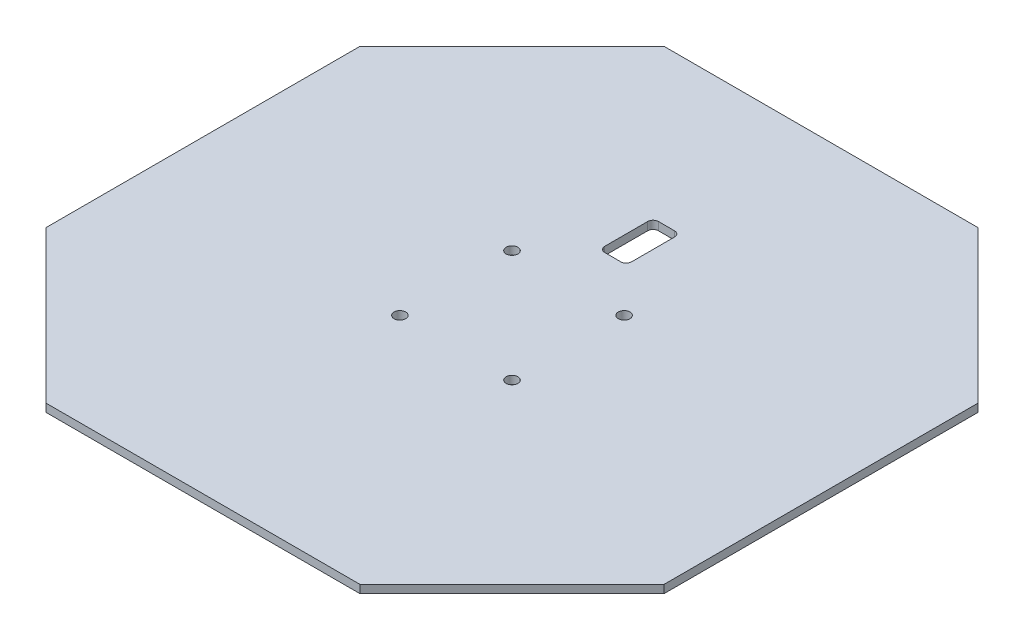
ISO-10303-21;
HEADER;
FILE_DESCRIPTION(('STEP AP214'),'2;1');
FILE_NAME('part.step','',(''),(''),'','','');
FILE_SCHEMA(('AUTOMOTIVE_DESIGN { 1 0 10303 214 1 1 1 1 }'));
ENDSEC;
DATA;
#1=APPLICATION_CONTEXT('core data for automotive mechanical design processes');
#2=APPLICATION_PROTOCOL_DEFINITION('international standard','automotive_design',2000,#1);
#3=PRODUCT_CONTEXT('',#1,'mechanical');
#4=PRODUCT('Part','Part','',(#3));
#5=PRODUCT_RELATED_PRODUCT_CATEGORY('part','',(#4));
#6=PRODUCT_DEFINITION_FORMATION('','',#4);
#7=PRODUCT_DEFINITION_CONTEXT('part definition',#1,'design');
#8=PRODUCT_DEFINITION('design','',#6,#7);
#9=PRODUCT_DEFINITION_SHAPE('','',#8);
#10=(LENGTH_UNIT() NAMED_UNIT(*) SI_UNIT(.MILLI.,.METRE.));
#11=(NAMED_UNIT(*) PLANE_ANGLE_UNIT() SI_UNIT($,.RADIAN.));
#12=(NAMED_UNIT(*) SI_UNIT($,.STERADIAN.) SOLID_ANGLE_UNIT());
#13=UNCERTAINTY_MEASURE_WITH_UNIT(LENGTH_MEASURE(1.E-05),#10,'distance_accuracy_value','');
#14=(GEOMETRIC_REPRESENTATION_CONTEXT(3) GLOBAL_UNCERTAINTY_ASSIGNED_CONTEXT((#13)) GLOBAL_UNIT_ASSIGNED_CONTEXT((#10,
#11,#12)) REPRESENTATION_CONTEXT('',''));
#15=CARTESIAN_POINT('',(0.,0.,0.));
#16=DIRECTION('',(0.,0.,1.));
#17=DIRECTION('',(1.,0.,0.));
#18=AXIS2_PLACEMENT_3D('',#15,#16,#17);
#19=CARTESIAN_POINT('',(112.,0.,-154.5));
#20=DIRECTION('',(0.,-1.,0.));
#21=DIRECTION('',(0.,0.,-1.));
#22=AXIS2_PLACEMENT_3D('',#19,#20,#21);
#23=CYLINDRICAL_SURFACE('',#22,2.);
#24=DIRECTION('',(0.,1.,0.));
#25=VECTOR('',#24,1.);
#26=CARTESIAN_POINT('',(112.,0.,-152.5));
#27=LINE('',#26,#25);
#28=CARTESIAN_POINT('',(112.,0.,-152.5));
#29=VERTEX_POINT('',#28);
#30=CARTESIAN_POINT('',(112.,3.,-152.5));
#31=VERTEX_POINT('',#30);
#32=EDGE_CURVE('E297',#29,#31,#27,.T.);
#33=ORIENTED_EDGE('',*,*,#32,.F.);
#34=CARTESIAN_POINT('',(112.,0.,-154.5));
#35=DIRECTION('',(0.,-1.,0.));
#36=DIRECTION('',(0.,0.,-1.));
#37=AXIS2_PLACEMENT_3D('',#34,#35,#36);
#38=CIRCLE('',#37,2.);
#39=CARTESIAN_POINT('',(110.,0.,-154.5));
#40=VERTEX_POINT('',#39);
#41=EDGE_CURVE('E60',#29,#40,#38,.T.);
#42=ORIENTED_EDGE('',*,*,#41,.T.);
#43=DIRECTION('',(0.,1.,0.));
#44=VECTOR('',#43,1.);
#45=CARTESIAN_POINT('',(110.,0.,-154.5));
#46=LINE('',#45,#44);
#47=CARTESIAN_POINT('',(110.,3.,-154.5));
#48=VERTEX_POINT('',#47);
#49=EDGE_CURVE('E301',#48,#40,#46,.F.);
#50=ORIENTED_EDGE('',*,*,#49,.F.);
#51=CARTESIAN_POINT('',(112.,3.,-154.5));
#52=DIRECTION('',(0.,-1.,0.));
#53=DIRECTION('',(0.,0.,-1.));
#54=AXIS2_PLACEMENT_3D('',#51,#52,#53);
#55=CIRCLE('',#54,2.);
#56=EDGE_CURVE('E13',#48,#31,#55,.F.);
#57=ORIENTED_EDGE('',*,*,#56,.T.);
#58=EDGE_LOOP('',(#33,#42,#50,#57));
#59=FACE_BOUND('',#58,.T.);
#60=ADVANCED_FACE('F52',(#59),#23,.F.);
#61=CARTESIAN_POINT('',(118.,0.,-154.5));
#62=DIRECTION('',(0.,-1.,0.));
#63=DIRECTION('',(0.,0.,-1.));
#64=AXIS2_PLACEMENT_3D('',#61,#62,#63);
#65=CYLINDRICAL_SURFACE('',#64,2.);
#66=DIRECTION('',(0.,1.,0.));
#67=VECTOR('',#66,1.);
#68=CARTESIAN_POINT('',(120.,0.,-154.5));
#69=LINE('',#68,#67);
#70=CARTESIAN_POINT('',(120.,0.,-154.5));
#71=VERTEX_POINT('',#70);
#72=CARTESIAN_POINT('',(120.,3.,-154.5));
#73=VERTEX_POINT('',#72);
#74=EDGE_CURVE('E282',#71,#73,#69,.T.);
#75=ORIENTED_EDGE('',*,*,#74,.F.);
#76=CARTESIAN_POINT('',(118.,0.,-154.5));
#77=DIRECTION('',(0.,-1.,0.));
#78=DIRECTION('',(0.,0.,-1.));
#79=AXIS2_PLACEMENT_3D('',#76,#77,#78);
#80=CIRCLE('',#79,2.);
#81=CARTESIAN_POINT('',(118.,0.,-152.5));
#82=VERTEX_POINT('',#81);
#83=EDGE_CURVE('E290',#71,#82,#80,.T.);
#84=ORIENTED_EDGE('',*,*,#83,.T.);
#85=DIRECTION('',(0.,1.,0.));
#86=VECTOR('',#85,1.);
#87=CARTESIAN_POINT('',(118.,0.,-152.5));
#88=LINE('',#87,#86);
#89=CARTESIAN_POINT('',(118.,3.,-152.5));
#90=VERTEX_POINT('',#89);
#91=EDGE_CURVE('E286',#90,#82,#88,.F.);
#92=ORIENTED_EDGE('',*,*,#91,.F.);
#93=CARTESIAN_POINT('',(118.,3.,-154.5));
#94=DIRECTION('',(0.,-1.,0.));
#95=DIRECTION('',(0.,0.,-1.));
#96=AXIS2_PLACEMENT_3D('',#93,#94,#95);
#97=CIRCLE('',#96,2.);
#98=EDGE_CURVE('E294',#90,#73,#97,.F.);
#99=ORIENTED_EDGE('',*,*,#98,.T.);
#100=EDGE_LOOP('',(#75,#84,#92,#99));
#101=FACE_BOUND('',#100,.T.);
#102=ADVANCED_FACE('F380',(#101),#65,.F.);
#103=CARTESIAN_POINT('',(112.,0.,-170.5));
#104=DIRECTION('',(0.,1.,0.));
#105=DIRECTION('',(0.,0.,1.));
#106=AXIS2_PLACEMENT_3D('',#103,#104,#105);
#107=CYLINDRICAL_SURFACE('',#106,2.);
#108=DIRECTION('',(0.,-1.,0.));
#109=VECTOR('',#108,1.);
#110=CARTESIAN_POINT('',(112.,0.,-172.5));
#111=LINE('',#110,#109);
#112=CARTESIAN_POINT('',(112.,3.,-172.5));
#113=VERTEX_POINT('',#112);
#114=CARTESIAN_POINT('',(112.,0.,-172.5));
#115=VERTEX_POINT('',#114);
#116=EDGE_CURVE('E268',#113,#115,#111,.T.);
#117=ORIENTED_EDGE('',*,*,#116,.F.);
#118=CARTESIAN_POINT('',(112.,3.,-170.5));
#119=DIRECTION('',(0.,-1.,0.));
#120=DIRECTION('',(0.,0.,-1.));
#121=AXIS2_PLACEMENT_3D('',#118,#119,#120);
#122=CIRCLE('',#121,2.);
#123=CARTESIAN_POINT('',(110.,3.,-170.5));
#124=VERTEX_POINT('',#123);
#125=EDGE_CURVE('E276',#113,#124,#122,.F.);
#126=ORIENTED_EDGE('',*,*,#125,.T.);
#127=DIRECTION('',(0.,-1.,0.));
#128=VECTOR('',#127,1.);
#129=CARTESIAN_POINT('',(110.,0.,-170.5));
#130=LINE('',#129,#128);
#131=CARTESIAN_POINT('',(110.,0.,-170.5));
#132=VERTEX_POINT('',#131);
#133=EDGE_CURVE('E272',#132,#124,#130,.F.);
#134=ORIENTED_EDGE('',*,*,#133,.F.);
#135=CARTESIAN_POINT('',(112.,0.,-170.5));
#136=DIRECTION('',(0.,-1.,0.));
#137=DIRECTION('',(0.,0.,-1.));
#138=AXIS2_PLACEMENT_3D('',#135,#136,#137);
#139=CIRCLE('',#138,2.);
#140=EDGE_CURVE('E279',#132,#115,#139,.T.);
#141=ORIENTED_EDGE('',*,*,#140,.T.);
#142=EDGE_LOOP('',(#117,#126,#134,#141));
#143=FACE_BOUND('',#142,.T.);
#144=ADVANCED_FACE('F402',(#143),#107,.F.);
#145=CARTESIAN_POINT('',(118.,0.,-170.5));
#146=DIRECTION('',(0.,1.,0.));
#147=DIRECTION('',(0.,0.,1.));
#148=AXIS2_PLACEMENT_3D('',#145,#146,#147);
#149=CYLINDRICAL_SURFACE('',#148,2.);
#150=DIRECTION('',(0.,-1.,0.));
#151=VECTOR('',#150,1.);
#152=CARTESIAN_POINT('',(120.,0.,-170.5));
#153=LINE('',#152,#151);
#154=CARTESIAN_POINT('',(120.,3.,-170.5));
#155=VERTEX_POINT('',#154);
#156=CARTESIAN_POINT('',(120.,0.,-170.5));
#157=VERTEX_POINT('',#156);
#158=EDGE_CURVE('E253',#155,#157,#153,.T.);
#159=ORIENTED_EDGE('',*,*,#158,.F.);
#160=CARTESIAN_POINT('',(118.,3.,-170.5));
#161=DIRECTION('',(0.,-1.,0.));
#162=DIRECTION('',(0.,0.,-1.));
#163=AXIS2_PLACEMENT_3D('',#160,#161,#162);
#164=CIRCLE('',#163,2.);
#165=CARTESIAN_POINT('',(118.,3.,-172.5));
#166=VERTEX_POINT('',#165);
#167=EDGE_CURVE('E261',#155,#166,#164,.F.);
#168=ORIENTED_EDGE('',*,*,#167,.T.);
#169=DIRECTION('',(0.,-1.,0.));
#170=VECTOR('',#169,1.);
#171=CARTESIAN_POINT('',(118.,0.,-172.5));
#172=LINE('',#171,#170);
#173=CARTESIAN_POINT('',(118.,0.,-172.5));
#174=VERTEX_POINT('',#173);
#175=EDGE_CURVE('E257',#174,#166,#172,.F.);
#176=ORIENTED_EDGE('',*,*,#175,.F.);
#177=CARTESIAN_POINT('',(118.,0.,-170.5));
#178=DIRECTION('',(0.,-1.,0.));
#179=DIRECTION('',(0.,0.,-1.));
#180=AXIS2_PLACEMENT_3D('',#177,#178,#179);
#181=CIRCLE('',#180,2.);
#182=EDGE_CURVE('E264',#174,#157,#181,.T.);
#183=ORIENTED_EDGE('',*,*,#182,.T.);
#184=EDGE_LOOP('',(#159,#168,#176,#183));
#185=FACE_BOUND('',#184,.T.);
#186=ADVANCED_FACE('F393',(#185),#149,.F.);
#187=CARTESIAN_POINT('',(0.,3.,0.));
#188=DIRECTION('',(0.,-1.,0.));
#189=DIRECTION('',(0.,0.,-1.));
#190=AXIS2_PLACEMENT_3D('',#187,#188,#189);
#191=PLANE('',#190);
#192=DIRECTION('',(1.,0.,0.));
#193=VECTOR('',#192,1.);
#194=CARTESIAN_POINT('',(115.,3.,-152.5));
#195=LINE('',#194,#193);
#196=EDGE_CURVE('E359',#31,#90,#195,.T.);
#197=ORIENTED_EDGE('',*,*,#196,.F.);
#198=ORIENTED_EDGE('',*,*,#56,.F.);
#199=DIRECTION('',(0.,0.,1.));
#200=VECTOR('',#199,1.);
#201=CARTESIAN_POINT('',(110.,3.,-152.5));
#202=LINE('',#201,#200);
#203=EDGE_CURVE('E347',#124,#48,#202,.T.);
#204=ORIENTED_EDGE('',*,*,#203,.F.);
#205=ORIENTED_EDGE('',*,*,#125,.F.);
#206=DIRECTION('',(-1.,0.,0.));
#207=VECTOR('',#206,1.);
#208=CARTESIAN_POINT('',(120.,3.,-172.5));
#209=LINE('',#208,#207);
#210=EDGE_CURVE('E352',#166,#113,#209,.T.);
#211=ORIENTED_EDGE('',*,*,#210,.F.);
#212=ORIENTED_EDGE('',*,*,#167,.F.);
#213=DIRECTION('',(0.,0.,-1.));
#214=VECTOR('',#213,1.);
#215=CARTESIAN_POINT('',(120.,3.,-152.5));
#216=LINE('',#215,#214);
#217=EDGE_CURVE('E356',#73,#155,#216,.T.);
#218=ORIENTED_EDGE('',*,*,#217,.F.);
#219=ORIENTED_EDGE('',*,*,#98,.F.);
#220=EDGE_LOOP('',(#197,#198,#204,#205,#211,#212,#218,#219));
#221=FACE_BOUND('',#220,.T.);
#222=CARTESIAN_POINT('',(135.859650045008,3.,-135.859650045004));
#223=DIRECTION('',(0.,1.,0.));
#224=DIRECTION('',(0.,0.,1.));
#225=AXIS2_PLACEMENT_3D('',#222,#223,#224);
#226=CIRCLE('',#225,2.182876);
#227=CARTESIAN_POINT('',(135.859650045008,3.,-133.676774045004));
#228=VERTEX_POINT('',#227);
#229=EDGE_CURVE('E334',#228,#228,#226,.T.);
#230=ORIENTED_EDGE('',*,*,#229,.F.);
#231=EDGE_LOOP('',(#230));
#232=FACE_BOUND('',#231,.T.);
#233=CARTESIAN_POINT('',(94.1403499550013,3.,-94.1403499549967));
#234=DIRECTION('',(0.,1.,0.));
#235=DIRECTION('',(0.,0.,1.));
#236=AXIS2_PLACEMENT_3D('',#233,#234,#235);
#237=CIRCLE('',#236,2.182876);
#238=CARTESIAN_POINT('',(94.1403499550013,3.,-91.9574739549966));
#239=VERTEX_POINT('',#238);
#240=EDGE_CURVE('E318',#239,#239,#237,.T.);
#241=ORIENTED_EDGE('',*,*,#240,.F.);
#242=EDGE_LOOP('',(#241));
#243=FACE_BOUND('',#242,.T.);
#244=DIRECTION('',(1.,0.,0.));
#245=VECTOR('',#244,1.);
#246=CARTESIAN_POINT('',(0.,3.,0.));
#247=LINE('',#246,#245);
#248=CARTESIAN_POINT('',(56.5685,3.,0.));
#249=VERTEX_POINT('',#248);
#250=CARTESIAN_POINT('',(173.4315,3.,0.));
#251=VERTEX_POINT('',#250);
#252=EDGE_CURVE('E185',#249,#251,#247,.T.);
#253=ORIENTED_EDGE('',*,*,#252,.T.);
#254=DIRECTION('',(-0.707106781186547,0.,0.707106781186548));
#255=VECTOR('',#254,1.);
#256=CARTESIAN_POINT('',(230.,3.,-56.5685));
#257=LINE('',#256,#255);
#258=CARTESIAN_POINT('',(230.,3.,-56.5685));
#259=VERTEX_POINT('',#258);
#260=EDGE_CURVE('E248',#251,#259,#257,.F.);
#261=ORIENTED_EDGE('',*,*,#260,.T.);
#262=DIRECTION('',(0.,0.,-1.));
#263=VECTOR('',#262,1.);
#264=CARTESIAN_POINT('',(230.,3.,0.));
#265=LINE('',#264,#263);
#266=CARTESIAN_POINT('',(230.,3.,-173.4315));
#267=VERTEX_POINT('',#266);
#268=EDGE_CURVE('E306',#259,#267,#265,.T.);
#269=ORIENTED_EDGE('',*,*,#268,.T.);
#270=DIRECTION('',(0.707106781186548,0.,0.707106781186548));
#271=VECTOR('',#270,1.);
#272=CARTESIAN_POINT('',(173.4315,3.,-230.));
#273=LINE('',#272,#271);
#274=CARTESIAN_POINT('',(173.4315,3.,-230.));
#275=VERTEX_POINT('',#274);
#276=EDGE_CURVE('E234',#267,#275,#273,.F.);
#277=ORIENTED_EDGE('',*,*,#276,.T.);
#278=DIRECTION('',(-1.,0.,0.));
#279=VECTOR('',#278,1.);
#280=CARTESIAN_POINT('',(0.,3.,-230.));
#281=LINE('',#280,#279);
#282=CARTESIAN_POINT('',(56.5685,3.,-230.));
#283=VERTEX_POINT('',#282);
#284=EDGE_CURVE('E187',#275,#283,#281,.T.);
#285=ORIENTED_EDGE('',*,*,#284,.T.);
#286=DIRECTION('',(0.707106781186548,0.,-0.707106781186547));
#287=VECTOR('',#286,1.);
#288=CARTESIAN_POINT('',(0.,3.,-173.4315));
#289=LINE('',#288,#287);
#290=CARTESIAN_POINT('',(0.,3.,-173.4315));
#291=VERTEX_POINT('',#290);
#292=EDGE_CURVE('E219',#283,#291,#289,.F.);
#293=ORIENTED_EDGE('',*,*,#292,.T.);
#294=DIRECTION('',(0.,0.,1.));
#295=VECTOR('',#294,1.);
#296=CARTESIAN_POINT('',(0.,3.,0.));
#297=LINE('',#296,#295);
#298=CARTESIAN_POINT('',(0.,3.,-56.5685));
#299=VERTEX_POINT('',#298);
#300=EDGE_CURVE('E206',#291,#299,#297,.T.);
#301=ORIENTED_EDGE('',*,*,#300,.T.);
#302=DIRECTION('',(-0.707106781186548,0.,-0.707106781186547));
#303=VECTOR('',#302,1.);
#304=CARTESIAN_POINT('',(56.5685,3.,0.));
#305=LINE('',#304,#303);
#306=EDGE_CURVE('E177',#299,#249,#305,.F.);
#307=ORIENTED_EDGE('',*,*,#306,.T.);
#308=EDGE_LOOP('',(#253,#261,#269,#277,#285,#293,#301,#307));
#309=FACE_BOUND('',#308,.T.);
#310=CARTESIAN_POINT('',(135.859650045002,3.,-94.1403499549978));
#311=DIRECTION('',(0.,1.,0.));
#312=DIRECTION('',(0.,0.,1.));
#313=AXIS2_PLACEMENT_3D('',#310,#311,#312);
#314=CIRCLE('',#313,2.182876);
#315=CARTESIAN_POINT('',(135.859650045002,3.,-91.9574739549978));
#316=VERTEX_POINT('',#315);
#317=EDGE_CURVE('E326',#316,#316,#314,.T.);
#318=ORIENTED_EDGE('',*,*,#317,.F.);
#319=EDGE_LOOP('',(#318));
#320=FACE_BOUND('',#319,.T.);
#321=CARTESIAN_POINT('',(94.1403499549938,3.,-135.859650045003));
#322=DIRECTION('',(0.,1.,0.));
#323=DIRECTION('',(0.,0.,1.));
#324=AXIS2_PLACEMENT_3D('',#321,#322,#323);
#325=CIRCLE('',#324,2.182876);
#326=CARTESIAN_POINT('',(94.1403499549938,3.,-133.676774045003));
#327=VERTEX_POINT('',#326);
#328=EDGE_CURVE('E342',#327,#327,#325,.T.);
#329=ORIENTED_EDGE('',*,*,#328,.F.);
#330=EDGE_LOOP('',(#329));
#331=FACE_BOUND('',#330,.T.);
#332=ADVANCED_FACE('F385',(#221,#232,#243,#309,#320,#331),#191,.F.);
#333=CARTESIAN_POINT('',(230.,3.,-56.5685));
#334=DIRECTION('',(-0.707106781186548,0.,-0.707106781186547));
#335=DIRECTION('',(0.,-1.,0.));
#336=AXIS2_PLACEMENT_3D('',#333,#334,#335);
#337=PLANE('',#336);
#338=DIRECTION('',(0.,-1.,0.));
#339=VECTOR('',#338,1.);
#340=CARTESIAN_POINT('',(230.,3.,-56.5685));
#341=LINE('',#340,#339);
#342=CARTESIAN_POINT('',(230.,0.,-56.5685));
#343=VERTEX_POINT('',#342);
#344=EDGE_CURVE('E241',#259,#343,#341,.T.);
#345=ORIENTED_EDGE('',*,*,#344,.F.);
#346=ORIENTED_EDGE('',*,*,#260,.F.);
#347=DIRECTION('',(0.,1.,0.));
#348=VECTOR('',#347,1.);
#349=CARTESIAN_POINT('',(173.4315,3.,0.));
#350=LINE('',#349,#348);
#351=CARTESIAN_POINT('',(173.4315,0.,0.));
#352=VERTEX_POINT('',#351);
#353=EDGE_CURVE('E245',#352,#251,#350,.T.);
#354=ORIENTED_EDGE('',*,*,#353,.F.);
#355=DIRECTION('',(0.707106781186547,0.,-0.707106781186548));
#356=VECTOR('',#355,1.);
#357=CARTESIAN_POINT('',(86.71575,0.,86.71575));
#358=LINE('',#357,#356);
#359=EDGE_CURVE('E191',#343,#352,#358,.F.);
#360=ORIENTED_EDGE('',*,*,#359,.F.);
#361=EDGE_LOOP('',(#345,#346,#354,#360));
#362=FACE_BOUND('',#361,.T.);
#363=ADVANCED_FACE('F417',(#362),#337,.F.);
#364=CARTESIAN_POINT('',(173.4315,3.,-230.));
#365=DIRECTION('',(-0.707106781186548,0.,0.707106781186548));
#366=DIRECTION('',(0.,-1.,0.));
#367=AXIS2_PLACEMENT_3D('',#364,#365,#366);
#368=PLANE('',#367);
#369=DIRECTION('',(0.,-1.,0.));
#370=VECTOR('',#369,1.);
#371=CARTESIAN_POINT('',(173.4315,3.,-230.));
#372=LINE('',#371,#370);
#373=CARTESIAN_POINT('',(173.4315,0.,-230.));
#374=VERTEX_POINT('',#373);
#375=EDGE_CURVE('E226',#275,#374,#372,.T.);
#376=ORIENTED_EDGE('',*,*,#375,.F.);
#377=ORIENTED_EDGE('',*,*,#276,.F.);
#378=DIRECTION('',(0.,1.,0.));
#379=VECTOR('',#378,1.);
#380=CARTESIAN_POINT('',(230.,3.,-173.4315));
#381=LINE('',#380,#379);
#382=CARTESIAN_POINT('',(230.,0.,-173.4315));
#383=VERTEX_POINT('',#382);
#384=EDGE_CURVE('E230',#383,#267,#381,.T.);
#385=ORIENTED_EDGE('',*,*,#384,.F.);
#386=DIRECTION('',(-0.707106781186548,0.,-0.707106781186548));
#387=VECTOR('',#386,1.);
#388=CARTESIAN_POINT('',(201.71575,0.,-201.71575));
#389=LINE('',#388,#387);
#390=EDGE_CURVE('E237',#374,#383,#389,.F.);
#391=ORIENTED_EDGE('',*,*,#390,.F.);
#392=EDGE_LOOP('',(#376,#377,#385,#391));
#393=FACE_BOUND('',#392,.T.);
#394=ADVANCED_FACE('F420',(#393),#368,.F.);
#395=CARTESIAN_POINT('',(0.,3.,-173.4315));
#396=DIRECTION('',(0.707106781186548,0.,0.707106781186548));
#397=DIRECTION('',(0.,-1.,0.));
#398=AXIS2_PLACEMENT_3D('',#395,#396,#397);
#399=PLANE('',#398);
#400=DIRECTION('',(0.,-1.,0.));
#401=VECTOR('',#400,1.);
#402=CARTESIAN_POINT('',(0.,3.,-173.4315));
#403=LINE('',#402,#401);
#404=CARTESIAN_POINT('',(0.,0.,-173.4315));
#405=VERTEX_POINT('',#404);
#406=EDGE_CURVE('E176',#291,#405,#403,.T.);
#407=ORIENTED_EDGE('',*,*,#406,.F.);
#408=ORIENTED_EDGE('',*,*,#292,.F.);
#409=DIRECTION('',(0.,1.,0.));
#410=VECTOR('',#409,1.);
#411=CARTESIAN_POINT('',(56.5685,3.,-230.));
#412=LINE('',#411,#410);
#413=CARTESIAN_POINT('',(56.5685,0.,-230.));
#414=VERTEX_POINT('',#413);
#415=EDGE_CURVE('E215',#414,#283,#412,.T.);
#416=ORIENTED_EDGE('',*,*,#415,.F.);
#417=DIRECTION('',(-0.707106781186548,0.,0.707106781186547));
#418=VECTOR('',#417,1.);
#419=CARTESIAN_POINT('',(-86.71575,0.,-86.7157500000001));
#420=LINE('',#419,#418);
#421=EDGE_CURVE('E222',#405,#414,#420,.F.);
#422=ORIENTED_EDGE('',*,*,#421,.F.);
#423=EDGE_LOOP('',(#407,#408,#416,#422));
#424=FACE_BOUND('',#423,.T.);
#425=ADVANCED_FACE('F424',(#424),#399,.F.);
#426=CARTESIAN_POINT('',(56.5685,3.,0.));
#427=DIRECTION('',(0.707106781186548,0.,-0.707106781186548));
#428=DIRECTION('',(0.,-1.,0.));
#429=AXIS2_PLACEMENT_3D('',#426,#427,#428);
#430=PLANE('',#429);
#431=DIRECTION('',(0.,-1.,0.));
#432=VECTOR('',#431,1.);
#433=CARTESIAN_POINT('',(56.5685,3.,0.));
#434=LINE('',#433,#432);
#435=CARTESIAN_POINT('',(56.5685,0.,0.));
#436=VERTEX_POINT('',#435);
#437=EDGE_CURVE('E168',#249,#436,#434,.T.);
#438=ORIENTED_EDGE('',*,*,#437,.F.);
#439=ORIENTED_EDGE('',*,*,#306,.F.);
#440=DIRECTION('',(0.,1.,0.));
#441=VECTOR('',#440,1.);
#442=CARTESIAN_POINT('',(0.,3.,-56.5685));
#443=LINE('',#442,#441);
#444=CARTESIAN_POINT('',(0.,0.,-56.5685));
#445=VERTEX_POINT('',#444);
#446=EDGE_CURVE('E171',#445,#299,#443,.T.);
#447=ORIENTED_EDGE('',*,*,#446,.F.);
#448=DIRECTION('',(0.707106781186548,0.,0.707106781186547));
#449=VECTOR('',#448,1.);
#450=CARTESIAN_POINT('',(28.28425,0.,-28.28425));
#451=LINE('',#450,#449);
#452=EDGE_CURVE('E164',#436,#445,#451,.F.);
#453=ORIENTED_EDGE('',*,*,#452,.F.);
#454=EDGE_LOOP('',(#438,#439,#447,#453));
#455=FACE_BOUND('',#454,.T.);
#456=ADVANCED_FACE('F166',(#455),#430,.F.);
#457=CARTESIAN_POINT('',(0.,3.,0.));
#458=DIRECTION('',(1.,0.,0.));
#459=DIRECTION('',(0.,0.,-1.));
#460=AXIS2_PLACEMENT_3D('',#457,#458,#459);
#461=PLANE('',#460);
#462=ORIENTED_EDGE('',*,*,#300,.F.);
#463=ORIENTED_EDGE('',*,*,#406,.T.);
#464=DIRECTION('',(0.,0.,1.));
#465=VECTOR('',#464,1.);
#466=CARTESIAN_POINT('',(0.,0.,0.));
#467=LINE('',#466,#465);
#468=EDGE_CURVE('E195',#405,#445,#467,.T.);
#469=ORIENTED_EDGE('',*,*,#468,.T.);
#470=ORIENTED_EDGE('',*,*,#446,.T.);
#471=EDGE_LOOP('',(#462,#463,#469,#470));
#472=FACE_BOUND('',#471,.T.);
#473=ADVANCED_FACE('F431',(#472),#461,.F.);
#474=CARTESIAN_POINT('',(0.,3.,0.));
#475=DIRECTION('',(0.,0.,-1.));
#476=DIRECTION('',(-1.,0.,0.));
#477=AXIS2_PLACEMENT_3D('',#474,#475,#476);
#478=PLANE('',#477);
#479=DIRECTION('',(1.,0.,0.));
#480=VECTOR('',#479,1.);
#481=CARTESIAN_POINT('',(0.,0.,0.));
#482=LINE('',#481,#480);
#483=EDGE_CURVE('E183',#436,#352,#482,.T.);
#484=ORIENTED_EDGE('',*,*,#483,.T.);
#485=ORIENTED_EDGE('',*,*,#353,.T.);
#486=ORIENTED_EDGE('',*,*,#252,.F.);
#487=ORIENTED_EDGE('',*,*,#437,.T.);
#488=EDGE_LOOP('',(#484,#485,#486,#487));
#489=FACE_BOUND('',#488,.T.);
#490=ADVANCED_FACE('F181',(#489),#478,.F.);
#491=CARTESIAN_POINT('',(230.,3.,0.));
#492=DIRECTION('',(-1.,0.,0.));
#493=DIRECTION('',(0.,0.,1.));
#494=AXIS2_PLACEMENT_3D('',#491,#492,#493);
#495=PLANE('',#494);
#496=ORIENTED_EDGE('',*,*,#268,.F.);
#497=ORIENTED_EDGE('',*,*,#344,.T.);
#498=DIRECTION('',(0.,0.,-1.));
#499=VECTOR('',#498,1.);
#500=CARTESIAN_POINT('',(230.,0.,0.));
#501=LINE('',#500,#499);
#502=EDGE_CURVE('E194',#343,#383,#501,.T.);
#503=ORIENTED_EDGE('',*,*,#502,.T.);
#504=ORIENTED_EDGE('',*,*,#384,.T.);
#505=EDGE_LOOP('',(#496,#497,#503,#504));
#506=FACE_BOUND('',#505,.T.);
#507=ADVANCED_FACE('F437',(#506),#495,.F.);
#508=CARTESIAN_POINT('',(0.,3.,-230.));
#509=DIRECTION('',(0.,0.,1.));
#510=DIRECTION('',(1.,0.,0.));
#511=AXIS2_PLACEMENT_3D('',#508,#509,#510);
#512=PLANE('',#511);
#513=ORIENTED_EDGE('',*,*,#284,.F.);
#514=ORIENTED_EDGE('',*,*,#375,.T.);
#515=DIRECTION('',(-1.,0.,0.));
#516=VECTOR('',#515,1.);
#517=CARTESIAN_POINT('',(0.,0.,-230.));
#518=LINE('',#517,#516);
#519=EDGE_CURVE('E199',#374,#414,#518,.T.);
#520=ORIENTED_EDGE('',*,*,#519,.T.);
#521=ORIENTED_EDGE('',*,*,#415,.T.);
#522=EDGE_LOOP('',(#513,#514,#520,#521));
#523=FACE_BOUND('',#522,.T.);
#524=ADVANCED_FACE('F440',(#523),#512,.F.);
#525=CARTESIAN_POINT('',(0.,0.,0.));
#526=DIRECTION('',(0.,-1.,0.));
#527=DIRECTION('',(0.,0.,-1.));
#528=AXIS2_PLACEMENT_3D('',#525,#526,#527);
#529=PLANE('',#528);
#530=ORIENTED_EDGE('',*,*,#41,.F.);
#531=DIRECTION('',(1.,0.,0.));
#532=VECTOR('',#531,1.);
#533=CARTESIAN_POINT('',(115.,0.,-152.5));
#534=LINE('',#533,#532);
#535=EDGE_CURVE('E351',#29,#82,#534,.T.);
#536=ORIENTED_EDGE('',*,*,#535,.T.);
#537=ORIENTED_EDGE('',*,*,#83,.F.);
#538=DIRECTION('',(0.,0.,-1.));
#539=VECTOR('',#538,1.);
#540=CARTESIAN_POINT('',(120.,0.,-152.5));
#541=LINE('',#540,#539);
#542=EDGE_CURVE('E369',#71,#157,#541,.T.);
#543=ORIENTED_EDGE('',*,*,#542,.T.);
#544=ORIENTED_EDGE('',*,*,#182,.F.);
#545=DIRECTION('',(-1.,0.,0.));
#546=VECTOR('',#545,1.);
#547=CARTESIAN_POINT('',(120.,0.,-172.5));
#548=LINE('',#547,#546);
#549=EDGE_CURVE('E365',#174,#115,#548,.T.);
#550=ORIENTED_EDGE('',*,*,#549,.T.);
#551=ORIENTED_EDGE('',*,*,#140,.F.);
#552=DIRECTION('',(0.,0.,1.));
#553=VECTOR('',#552,1.);
#554=CARTESIAN_POINT('',(110.,0.,-152.5));
#555=LINE('',#554,#553);
#556=EDGE_CURVE('E346',#132,#40,#555,.T.);
#557=ORIENTED_EDGE('',*,*,#556,.T.);
#558=EDGE_LOOP('',(#530,#536,#537,#543,#544,#550,#551,#557));
#559=FACE_BOUND('',#558,.T.);
#560=CARTESIAN_POINT('',(94.1403499549938,0.,-135.859650045003));
#561=DIRECTION('',(0.,-1.,0.));
#562=DIRECTION('',(0.,0.,-1.));
#563=AXIS2_PLACEMENT_3D('',#560,#561,#562);
#564=CIRCLE('',#563,2.182876);
#565=CARTESIAN_POINT('',(94.1403499549938,0.,-138.042526045003));
#566=VERTEX_POINT('',#565);
#567=EDGE_CURVE('E338',#566,#566,#564,.T.);
#568=ORIENTED_EDGE('',*,*,#567,.F.);
#569=EDGE_LOOP('',(#568));
#570=FACE_BOUND('',#569,.T.);
#571=CARTESIAN_POINT('',(135.859650045008,0.,-135.859650045004));
#572=DIRECTION('',(0.,-1.,0.));
#573=DIRECTION('',(0.,0.,-1.));
#574=AXIS2_PLACEMENT_3D('',#571,#572,#573);
#575=CIRCLE('',#574,2.182876);
#576=CARTESIAN_POINT('',(135.859650045008,0.,-138.042526045004));
#577=VERTEX_POINT('',#576);
#578=EDGE_CURVE('E330',#577,#577,#575,.T.);
#579=ORIENTED_EDGE('',*,*,#578,.F.);
#580=EDGE_LOOP('',(#579));
#581=FACE_BOUND('',#580,.T.);
#582=CARTESIAN_POINT('',(135.859650045002,0.,-94.1403499549978));
#583=DIRECTION('',(0.,-1.,0.));
#584=DIRECTION('',(0.,0.,-1.));
#585=AXIS2_PLACEMENT_3D('',#582,#583,#584);
#586=CIRCLE('',#585,2.182876);
#587=CARTESIAN_POINT('',(135.859650045002,0.,-96.3232259549978));
#588=VERTEX_POINT('',#587);
#589=EDGE_CURVE('E322',#588,#588,#586,.T.);
#590=ORIENTED_EDGE('',*,*,#589,.F.);
#591=EDGE_LOOP('',(#590));
#592=FACE_BOUND('',#591,.T.);
#593=CARTESIAN_POINT('',(94.1403499550013,0.,-94.1403499549967));
#594=DIRECTION('',(0.,-1.,0.));
#595=DIRECTION('',(0.,0.,-1.));
#596=AXIS2_PLACEMENT_3D('',#593,#594,#595);
#597=CIRCLE('',#596,2.182876);
#598=CARTESIAN_POINT('',(94.1403499550013,0.,-96.3232259549966));
#599=VERTEX_POINT('',#598);
#600=EDGE_CURVE('E201',#599,#599,#597,.T.);
#601=ORIENTED_EDGE('',*,*,#600,.F.);
#602=EDGE_LOOP('',(#601));
#603=FACE_BOUND('',#602,.T.);
#604=ORIENTED_EDGE('',*,*,#502,.F.);
#605=ORIENTED_EDGE('',*,*,#359,.T.);
#606=ORIENTED_EDGE('',*,*,#483,.F.);
#607=ORIENTED_EDGE('',*,*,#452,.T.);
#608=ORIENTED_EDGE('',*,*,#468,.F.);
#609=ORIENTED_EDGE('',*,*,#421,.T.);
#610=ORIENTED_EDGE('',*,*,#519,.F.);
#611=ORIENTED_EDGE('',*,*,#390,.T.);
#612=EDGE_LOOP('',(#604,#605,#606,#607,#608,#609,#610,#611));
#613=FACE_BOUND('',#612,.T.);
#614=ADVANCED_FACE('F190',(#559,#570,#581,#592,#603,#613),#529,.T.);
#615=CARTESIAN_POINT('',(94.1403499550013,3.,-94.1403499549967));
#616=DIRECTION('',(0.,1.,0.));
#617=DIRECTION('',(0.,0.,1.));
#618=AXIS2_PLACEMENT_3D('',#615,#616,#617);
#619=CYLINDRICAL_SURFACE('',#618,2.182876);
#620=ORIENTED_EDGE('',*,*,#240,.T.);
#621=EDGE_LOOP('',(#620));
#622=FACE_BOUND('',#621,.T.);
#623=ORIENTED_EDGE('',*,*,#600,.T.);
#624=EDGE_LOOP('',(#623));
#625=FACE_BOUND('',#624,.T.);
#626=ADVANCED_FACE('F447',(#622,#625),#619,.F.);
#627=CARTESIAN_POINT('',(135.859650045002,3.,-94.1403499549978));
#628=DIRECTION('',(0.,1.,0.));
#629=DIRECTION('',(0.,0.,1.));
#630=AXIS2_PLACEMENT_3D('',#627,#628,#629);
#631=CYLINDRICAL_SURFACE('',#630,2.182876);
#632=ORIENTED_EDGE('',*,*,#317,.T.);
#633=EDGE_LOOP('',(#632));
#634=FACE_BOUND('',#633,.T.);
#635=ORIENTED_EDGE('',*,*,#589,.T.);
#636=EDGE_LOOP('',(#635));
#637=FACE_BOUND('',#636,.T.);
#638=ADVANCED_FACE('F452',(#634,#637),#631,.F.);
#639=CARTESIAN_POINT('',(135.859650045008,3.,-135.859650045004));
#640=DIRECTION('',(0.,1.,0.));
#641=DIRECTION('',(0.,0.,1.));
#642=AXIS2_PLACEMENT_3D('',#639,#640,#641);
#643=CYLINDRICAL_SURFACE('',#642,2.182876);
#644=ORIENTED_EDGE('',*,*,#229,.T.);
#645=EDGE_LOOP('',(#644));
#646=FACE_BOUND('',#645,.T.);
#647=ORIENTED_EDGE('',*,*,#578,.T.);
#648=EDGE_LOOP('',(#647));
#649=FACE_BOUND('',#648,.T.);
#650=ADVANCED_FACE('F456',(#646,#649),#643,.F.);
#651=CARTESIAN_POINT('',(94.1403499549938,3.,-135.859650045003));
#652=DIRECTION('',(0.,1.,0.));
#653=DIRECTION('',(0.,0.,1.));
#654=AXIS2_PLACEMENT_3D('',#651,#652,#653);
#655=CYLINDRICAL_SURFACE('',#654,2.182876);
#656=ORIENTED_EDGE('',*,*,#328,.T.);
#657=EDGE_LOOP('',(#656));
#658=FACE_BOUND('',#657,.T.);
#659=ORIENTED_EDGE('',*,*,#567,.T.);
#660=EDGE_LOOP('',(#659));
#661=FACE_BOUND('',#660,.T.);
#662=ADVANCED_FACE('F460',(#658,#661),#655,.F.);
#663=CARTESIAN_POINT('',(110.,0.,-152.5));
#664=DIRECTION('',(-1.,0.,0.));
#665=DIRECTION('',(0.,0.,1.));
#666=AXIS2_PLACEMENT_3D('',#663,#664,#665);
#667=PLANE('',#666);
#668=ORIENTED_EDGE('',*,*,#203,.T.);
#669=ORIENTED_EDGE('',*,*,#49,.T.);
#670=ORIENTED_EDGE('',*,*,#556,.F.);
#671=ORIENTED_EDGE('',*,*,#133,.T.);
#672=EDGE_LOOP('',(#668,#669,#670,#671));
#673=FACE_BOUND('',#672,.T.);
#674=ADVANCED_FACE('F404',(#673),#667,.F.);
#675=CARTESIAN_POINT('',(120.,0.,-172.5));
#676=DIRECTION('',(0.,0.,-1.));
#677=DIRECTION('',(-1.,0.,0.));
#678=AXIS2_PLACEMENT_3D('',#675,#676,#677);
#679=PLANE('',#678);
#680=ORIENTED_EDGE('',*,*,#210,.T.);
#681=ORIENTED_EDGE('',*,*,#116,.T.);
#682=ORIENTED_EDGE('',*,*,#549,.F.);
#683=ORIENTED_EDGE('',*,*,#175,.T.);
#684=EDGE_LOOP('',(#680,#681,#682,#683));
#685=FACE_BOUND('',#684,.T.);
#686=ADVANCED_FACE('F397',(#685),#679,.F.);
#687=CARTESIAN_POINT('',(120.,0.,-152.5));
#688=DIRECTION('',(1.,0.,0.));
#689=DIRECTION('',(0.,0.,-1.));
#690=AXIS2_PLACEMENT_3D('',#687,#688,#689);
#691=PLANE('',#690);
#692=ORIENTED_EDGE('',*,*,#542,.F.);
#693=ORIENTED_EDGE('',*,*,#74,.T.);
#694=ORIENTED_EDGE('',*,*,#217,.T.);
#695=ORIENTED_EDGE('',*,*,#158,.T.);
#696=EDGE_LOOP('',(#692,#693,#694,#695));
#697=FACE_BOUND('',#696,.T.);
#698=ADVANCED_FACE('F389',(#697),#691,.F.);
#699=CARTESIAN_POINT('',(115.,0.,-152.5));
#700=DIRECTION('',(0.,0.,1.));
#701=DIRECTION('',(1.,0.,0.));
#702=AXIS2_PLACEMENT_3D('',#699,#700,#701);
#703=PLANE('',#702);
#704=ORIENTED_EDGE('',*,*,#535,.F.);
#705=ORIENTED_EDGE('',*,*,#32,.T.);
#706=ORIENTED_EDGE('',*,*,#196,.T.);
#707=ORIENTED_EDGE('',*,*,#91,.T.);
#708=EDGE_LOOP('',(#704,#705,#706,#707));
#709=FACE_BOUND('',#708,.T.);
#710=ADVANCED_FACE('F382',(#709),#703,.F.);
#711=CLOSED_SHELL('',(#60,#102,#144,#186,#332,#363,#394,#425,#456,#473,#490,#507,#524,#614,#626,
#638,#650,#662,#674,#686,#698,#710));
#712=MANIFOLD_SOLID_BREP('B2',#711);
#713=ADVANCED_BREP_SHAPE_REPRESENTATION('',(#18,#712),#14);
#714=SHAPE_DEFINITION_REPRESENTATION(#9,#713);
ENDSEC;
END-ISO-10303-21;
